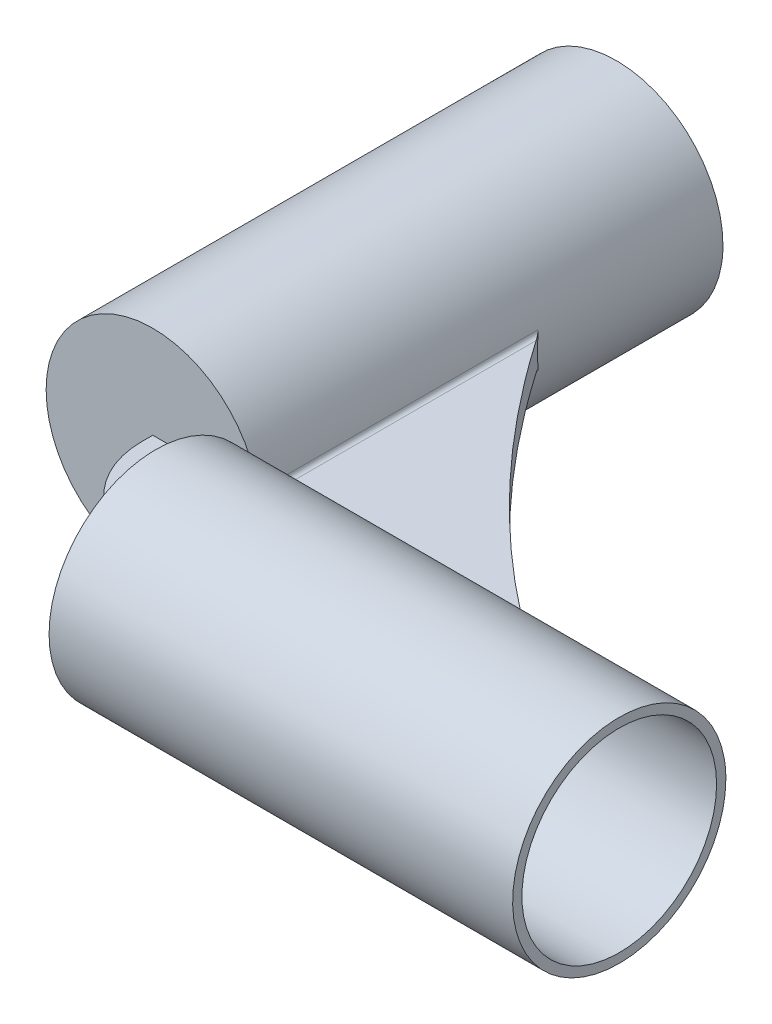
ISO-10303-21;
HEADER;
FILE_DESCRIPTION(('STEP AP214'),'2;1');
FILE_NAME('part.step','',(''),(''),'','','');
FILE_SCHEMA(('AUTOMOTIVE_DESIGN { 1 0 10303 214 1 1 1 1 }'));
ENDSEC;
DATA;
#1=APPLICATION_CONTEXT('core data for automotive mechanical design processes');
#2=APPLICATION_PROTOCOL_DEFINITION('international standard','automotive_design',2000,#1);
#3=PRODUCT_CONTEXT('',#1,'mechanical');
#4=PRODUCT('Part','Part','',(#3));
#5=PRODUCT_RELATED_PRODUCT_CATEGORY('part','',(#4));
#6=PRODUCT_DEFINITION_FORMATION('','',#4);
#7=PRODUCT_DEFINITION_CONTEXT('part definition',#1,'design');
#8=PRODUCT_DEFINITION('design','',#6,#7);
#9=PRODUCT_DEFINITION_SHAPE('','',#8);
#10=(LENGTH_UNIT() NAMED_UNIT(*) SI_UNIT(.MILLI.,.METRE.));
#11=(NAMED_UNIT(*) PLANE_ANGLE_UNIT() SI_UNIT($,.RADIAN.));
#12=(NAMED_UNIT(*) SI_UNIT($,.STERADIAN.) SOLID_ANGLE_UNIT());
#13=UNCERTAINTY_MEASURE_WITH_UNIT(LENGTH_MEASURE(1.E-05),#10,'distance_accuracy_value','');
#14=(GEOMETRIC_REPRESENTATION_CONTEXT(3) GLOBAL_UNCERTAINTY_ASSIGNED_CONTEXT((#13)) GLOBAL_UNIT_ASSIGNED_CONTEXT((#10,
#11,#12)) REPRESENTATION_CONTEXT('',''));
#15=CARTESIAN_POINT('',(0.,0.,0.));
#16=DIRECTION('',(0.,0.,1.));
#17=DIRECTION('',(1.,0.,0.));
#18=AXIS2_PLACEMENT_3D('',#15,#16,#17);
#19=CARTESIAN_POINT('',(26.1714704420663,-1.5,37.7135369474852));
#20=DIRECTION('',(0.,1.,0.));
#21=DIRECTION('',(0.,0.,1.));
#22=AXIS2_PLACEMENT_3D('',#19,#20,#21);
#23=PLANE('',#22);
#24=CARTESIAN_POINT('',(61.5,-1.5,61.1844233042564));
#25=CARTESIAN_POINT('',(21.5929408841325,-1.5,44.8348622428421));
#26=CARTESIAN_POINT('',(0.,-1.5,0.));
#27=B_SPLINE_CURVE_WITH_KNOTS('',2,(#24,#25,#26),.UNSPECIFIED.,.F.,.F.,(3,3),(0.,1.),.UNSPECIFIED.);
#28=CARTESIAN_POINT('',(39.9591197955266,-1.5,49.3522637381935));
#29=VERTEX_POINT('',#28);
#30=CARTESIAN_POINT('',(11.8321595617195,-1.5,20.4798726120123));
#31=VERTEX_POINT('',#30);
#32=EDGE_CURVE('E48',#29,#31,#27,.T.);
#33=ORIENTED_EDGE('',*,*,#32,.F.);
#34=DIRECTION('',(1.,0.,0.));
#35=VECTOR('',#34,1.);
#36=CARTESIAN_POINT('',(11.5,-1.5,49.3522637380573));
#37=LINE('',#36,#35);
#38=CARTESIAN_POINT('',(11.8321595661992,-1.5,49.3522637380573));
#39=VERTEX_POINT('',#38);
#40=EDGE_CURVE('E267',#29,#39,#37,.F.);
#41=ORIENTED_EDGE('',*,*,#40,.T.);
#42=DIRECTION('',(0.,0.,1.));
#43=VECTOR('',#42,1.);
#44=CARTESIAN_POINT('',(11.8321595661992,-1.5,19.8540203703433));
#45=LINE('',#44,#43);
#46=EDGE_CURVE('E99',#39,#31,#45,.F.);
#47=ORIENTED_EDGE('',*,*,#46,.T.);
#48=EDGE_LOOP('',(#33,#41,#47));
#49=FACE_BOUND('',#48,.T.);
#50=ADVANCED_FACE('F44',(#49),#23,.F.);
#51=CARTESIAN_POINT('',(26.1714704420663,1.5,37.7135369474852));
#52=DIRECTION('',(0.,1.,0.));
#53=DIRECTION('',(0.,0.,1.));
#54=AXIS2_PLACEMENT_3D('',#51,#52,#53);
#55=PLANE('',#54);
#56=DIRECTION('',(0.,0.,-1.));
#57=VECTOR('',#56,1.);
#58=CARTESIAN_POINT('',(11.4999999999999,1.5,37.7135369474852));
#59=LINE('',#58,#57);
#60=CARTESIAN_POINT('',(11.5,1.5,61.1419503280094));
#61=VERTEX_POINT('',#60);
#62=CARTESIAN_POINT('',(11.5,1.5,50.));
#63=VERTEX_POINT('',#62);
#64=EDGE_CURVE('E266',#61,#63,#59,.T.);
#65=ORIENTED_EDGE('',*,*,#64,.T.);
#66=DIRECTION('',(-1.,0.,0.));
#67=VECTOR('',#66,1.);
#68=CARTESIAN_POINT('',(0.,1.5,50.));
#69=LINE('',#68,#67);
#70=CARTESIAN_POINT('',(0.,1.5,50.));
#71=VERTEX_POINT('',#70);
#72=EDGE_CURVE('E90',#63,#71,#69,.T.);
#73=ORIENTED_EDGE('',*,*,#72,.T.);
#74=DIRECTION('',(0.,0.,1.));
#75=VECTOR('',#74,1.);
#76=CARTESIAN_POINT('',(0.,1.5,61.1321815434726));
#77=LINE('',#76,#75);
#78=CARTESIAN_POINT('',(0.,1.5,51.1406725308152));
#79=VERTEX_POINT('',#78);
#80=EDGE_CURVE('E158',#71,#79,#77,.T.);
#81=ORIENTED_EDGE('',*,*,#80,.T.);
#82=CARTESIAN_POINT('',(10.,1.5,51.1406725308152));
#83=DIRECTION('',(0.,1.,0.));
#84=DIRECTION('',(0.,0.,1.));
#85=AXIS2_PLACEMENT_3D('',#82,#83,#84);
#86=CIRCLE('',#85,10.);
#87=CARTESIAN_POINT('',(9.99150540781538,1.5,61.1406689229097));
#88=VERTEX_POINT('',#87);
#89=EDGE_CURVE('E165',#79,#88,#86,.T.);
#90=ORIENTED_EDGE('',*,*,#89,.T.);
#91=DIRECTION('',(0.999999639209453,0.,0.000849459218462283));
#92=VECTOR('',#91,1.);
#93=CARTESIAN_POINT('',(61.5,1.5,61.1844233042564));
#94=LINE('',#93,#92);
#95=EDGE_CURVE('E170',#88,#61,#94,.T.);
#96=ORIENTED_EDGE('',*,*,#95,.T.);
#97=EDGE_LOOP('',(#65,#73,#81,#90,#96));
#98=FACE_BOUND('',#97,.T.);
#99=ADVANCED_FACE('F164',(#98),#55,.T.);
#100=CARTESIAN_POINT('',(61.5,1.5,61.1844233042564));
#101=CARTESIAN_POINT('',(21.5929408841325,1.5,44.8348622428421));
#102=CARTESIAN_POINT('',(0.,1.5,0.));
#103=B_SPLINE_CURVE_WITH_KNOTS('',2,(#100,#101,#102),.UNSPECIFIED.,.F.,.F.,(3,3),(0.,1.),.UNSPECIFIED.);
#104=DIRECTION('',(0.,-1.,0.));
#105=VECTOR('',#104,1.);
#106=SURFACE_OF_LINEAR_EXTRUSION('',#103,#105);
#107=CARTESIAN_POINT('',(40.6592068639217,-1.91666666666667,49.8452703866488));
#108=CARTESIAN_POINT('',(40.6425501103773,-1.84786208140813,49.8336404502735));
#109=CARTESIAN_POINT('',(40.6267530440321,-1.77875662178033,49.8226037211432));
#110=CARTESIAN_POINT('',(40.5968843253305,-1.63985466646673,49.8017249348678));
#111=CARTESIAN_POINT('',(40.5828160010725,-1.57005710901577,49.7918851824445));
#112=CARTESIAN_POINT('',(40.5351088290527,-1.31629838707604,49.7585028006326));
#113=CARTESIAN_POINT('',(40.5067431395523,-1.13081215657099,49.7386244397177));
#114=CARTESIAN_POINT('',(40.462879679633,-0.757487481015358,49.7078679157044));
#115=CARTESIAN_POINT('',(40.4473897663862,-0.569647670596903,49.6969952481556));
#116=CARTESIAN_POINT('',(40.4295910935103,-0.193058017227148,49.6845009250577));
#117=CARTESIAN_POINT('',(40.4272804681157,-0.00430830687532004,49.6828779600466));
#118=CARTESIAN_POINT('',(40.4358835274511,0.372644328864946,49.6889182158702));
#119=CARTESIAN_POINT('',(40.4467895631452,0.560847507389801,49.6965760655084));
#120=CARTESIAN_POINT('',(40.4759404704321,0.874581473730704,49.7170263921436));
#121=CARTESIAN_POINT('',(40.4906529560247,1.00062118829927,49.7273445390168));
#122=CARTESIAN_POINT('',(40.5258597853129,1.25137278723459,49.7520170781482));
#123=CARTESIAN_POINT('',(40.5463482652861,1.37608588580541,49.7663673769639));
#124=CARTESIAN_POINT('',(40.5828013075669,1.56997673331845,49.791874929953));
#125=CARTESIAN_POINT('',(40.5968531106718,1.63969866391494,49.801703117051));
#126=CARTESIAN_POINT('',(40.6267180390527,1.77860463977761,49.8225792502017));
#127=CARTESIAN_POINT('',(40.6425317313701,1.84778850416581,49.8336275889343));
#128=CARTESIAN_POINT('',(40.6592068639217,1.91666666666667,49.8452703866488));
#129=B_SPLINE_CURVE_WITH_KNOTS('',3,(#107,#108,#109,#110,#111,#112,#113,#114,#115,#116,#117,
#118,#119,#120,#121,#122,#123,#124,#125,#126,#127,#128),.UNSPECIFIED.,.F.,.F.,(4,2,2,2,2,2,2,2,
2,2,4),(0.,0.215199849304263,0.430807708595344,0.996168056278801,1.56187315049264,
2.12749815697276,2.69279596881663,3.07455562803561,3.45592911632852,3.67129821337173,
3.88673682548817),.UNSPECIFIED.);
#130=CARTESIAN_POINT('',(40.6592068639218,-1.91666666666666,49.8452703866488));
#131=VERTEX_POINT('',#130);
#132=CARTESIAN_POINT('',(40.6592068639217,1.91666666666666,49.8452703866488));
#133=VERTEX_POINT('',#132);
#134=EDGE_CURVE('E162',#131,#133,#129,.T.);
#135=ORIENTED_EDGE('',*,*,#134,.F.);
#136=CARTESIAN_POINT('',(40.6592068639218,-1.91666666666666,49.8452703866488));
#137=CARTESIAN_POINT('',(40.6534948312875,-1.89303407075664,49.8412821935652));
#138=CARTESIAN_POINT('',(40.6455246430659,-1.87045745755028,49.8357165409185));
#139=CARTESIAN_POINT('',(40.6262566238628,-1.82797444168572,49.8222556999883));
#140=CARTESIAN_POINT('',(40.6150156241668,-1.80803025836246,49.8144002930168));
#141=CARTESIAN_POINT('',(40.5864783140091,-1.76506980361908,49.7944476597912));
#142=CARTESIAN_POINT('',(40.5683735501093,-1.74287704119174,49.781782451699));
#143=CARTESIAN_POINT('',(40.5294833582413,-1.70206370401495,49.7545558428827));
#144=CARTESIAN_POINT('',(40.5086784618006,-1.68347178934001,49.7399806626619));
#145=CARTESIAN_POINT('',(40.4516053296794,-1.63875510978594,49.6999636819857));
#146=CARTESIAN_POINT('',(40.4139222559375,-1.61536617584461,49.6735093461784));
#147=CARTESIAN_POINT('',(40.3362107443147,-1.57566747539168,49.6188730753598));
#148=CARTESIAN_POINT('',(40.2961781753437,-1.55937062939773,49.5906880930911));
#149=CARTESIAN_POINT('',(40.2312347512579,-1.53821309576535,49.5448951380918));
#150=CARTESIAN_POINT('',(40.2067216619404,-1.53138942034216,49.52759516247));
#151=CARTESIAN_POINT('',(40.1573801002096,-1.51978767468377,49.4927409507969));
#152=CARTESIAN_POINT('',(40.1325515296538,-1.51501025789447,49.4751866353728));
#153=CARTESIAN_POINT('',(40.0829823353489,-1.50745343697358,49.4401080184524));
#154=CARTESIAN_POINT('',(40.058243652195,-1.50465303515744,49.4225854359925));
#155=CARTESIAN_POINT('',(40.0087067986515,-1.50093023434502,49.3874662984272));
#156=CARTESIAN_POINT('',(39.9839086913586,-1.50000634090523,49.3698698133787));
#157=CARTESIAN_POINT('',(39.9591197954626,-1.5,49.352263738148));
#158=B_SPLINE_CURVE_WITH_KNOTS('',3,(#136,#137,#138,#139,#140,#141,#142,#143,#144,#145,#146,
#147,#148,#149,#150,#151,#152,#153,#154,#155,#156,#157),.UNSPECIFIED.,.F.,.F.,(4,2,2,2,2,2,2,2,
2,2,4),(0.,0.0734012187649057,0.145596320474933,0.239040182630463,0.333199703987055,
0.487281872786016,0.641643588458705,0.733886183631671,0.826158213347521,0.917434855049991,
1.00863877586489),.UNSPECIFIED.);
#159=EDGE_CURVE('E172',#131,#29,#158,.T.);
#160=ORIENTED_EDGE('',*,*,#159,.T.);
#161=ORIENTED_EDGE('',*,*,#32,.T.);
#162=CARTESIAN_POINT('',(11.8321595661992,-1.5,20.4798726120123));
#163=CARTESIAN_POINT('',(11.8081094150477,-1.50002370111057,20.4451111264115));
#164=CARTESIAN_POINT('',(11.7840675332719,-1.50173712524963,20.410325939331));
#165=CARTESIAN_POINT('',(11.7360926871098,-1.50870829394207,20.3408440912597));
#166=CARTESIAN_POINT('',(11.7121604774124,-1.51397940499566,20.3061482612705));
#167=CARTESIAN_POINT('',(11.6645905057809,-1.5282604175751,20.2371152039247));
#168=CARTESIAN_POINT('',(11.640954231312,-1.53728462840712,20.202779870299));
#169=CARTESIAN_POINT('',(11.5943649938752,-1.5594108375592,20.1350362985247));
#170=CARTESIAN_POINT('',(11.5714108589505,-1.57250533881332,20.101626477901));
#171=CARTESIAN_POINT('',(11.5317039918901,-1.59979348137028,20.0437795689982));
#172=CARTESIAN_POINT('',(11.5147386177175,-1.61304259131244,20.0190452612058));
#173=CARTESIAN_POINT('',(11.4816699903266,-1.64271582471135,19.9708008342689));
#174=CARTESIAN_POINT('',(11.4655687551884,-1.65914699970938,19.9472935839804));
#175=CARTESIAN_POINT('',(11.4345199985781,-1.69590953363564,19.9019350686278));
#176=CARTESIAN_POINT('',(11.4195914508104,-1.71629155604546,19.8801111128867));
#177=CARTESIAN_POINT('',(11.3920507374661,-1.76126982871442,19.8398273898705));
#178=CARTESIAN_POINT('',(11.3794200332247,-1.7858289445653,19.8213407082531));
#179=CARTESIAN_POINT('',(11.3622162605981,-1.8284211040254,19.7961506869004));
#180=CARTESIAN_POINT('',(11.3564714926554,-1.84495058325497,19.7877365733781));
#181=CARTESIAN_POINT('',(11.3465186872924,-1.87964652988499,19.7731565155303));
#182=CARTESIAN_POINT('',(11.3423304548717,-1.89783065648012,19.7670195465314));
#183=CARTESIAN_POINT('',(11.3391529176076,-1.91666666666684,19.7623631352614));
#184=B_SPLINE_CURVE_WITH_KNOTS('',3,(#162,#163,#164,#165,#166,#167,#168,#169,#170,#171,#172,
#173,#174,#175,#176,#177,#178,#179,#180,#181,#182,#183),.UNSPECIFIED.,.F.,.F.,(4,2,2,2,2,2,2,2,
2,2,4),(0.,0.126800562084867,0.254080195145305,0.381849617109322,0.509385081363142,
0.607604761143041,0.706044641831131,0.805842138836599,0.904794839726361,0.962809628095832,
1.02153917679552),.UNSPECIFIED.);
#185=CARTESIAN_POINT('',(11.3391529176076,-1.91666666666667,19.7623631352611));
#186=VERTEX_POINT('',#185);
#187=EDGE_CURVE('E203',#31,#186,#184,.T.);
#188=ORIENTED_EDGE('',*,*,#187,.T.);
#189=CARTESIAN_POINT('',(11.3391529176074,-1.91666666666807,19.7623631352611));
#190=CARTESIAN_POINT('',(11.3507799975667,-1.84787908265887,19.7794017329531));
#191=CARTESIAN_POINT('',(11.3618155766701,-1.77878222811811,19.7955652730237));
#192=CARTESIAN_POINT('',(11.382694712914,-1.6398800422499,19.8261337415504));
#193=CARTESIAN_POINT('',(11.3925359443036,-1.57007360666333,19.8405352392158));
#194=CARTESIAN_POINT('',(11.425541697391,-1.3191780530857,19.8888181748417));
#195=CARTESIAN_POINT('',(11.445181237914,-1.13657707818301,19.9175141148101));
#196=CARTESIAN_POINT('',(11.4757427912019,-0.769004637503896,19.962148028165));
#197=CARTESIAN_POINT('',(11.4866595720239,-0.584031816558466,19.9780783447008));
#198=CARTESIAN_POINT('',(11.4995218435123,-0.213128100523489,19.9968460463756));
#199=CARTESIAN_POINT('',(11.5014684502105,-0.0271973275001735,19.9996850602802));
#200=CARTESIAN_POINT('',(11.4963471172089,0.34418178882737,19.9922136537984));
#201=CARTESIAN_POINT('',(11.489284251006,0.529630344772638,19.9819106340744));
#202=CARTESIAN_POINT('',(11.4695749301962,0.846420247756011,19.9531396879581));
#203=CARTESIAN_POINT('',(11.4590790541375,0.978196215681208,19.9378145497305));
#204=CARTESIAN_POINT('',(11.4336788188877,1.2402800642973,19.9007039856013));
#205=CARTESIAN_POINT('',(11.4187789864561,1.37058931052918,19.8789251932535));
#206=CARTESIAN_POINT('',(11.3925460115424,1.56999489762221,19.8405499952391));
#207=CARTESIAN_POINT('',(11.3827161426456,1.63972692708785,19.8261651159792));
#208=CARTESIAN_POINT('',(11.3618396119236,1.77863284445968,19.7956004623972));
#209=CARTESIAN_POINT('',(11.3507926317531,1.84780658123796,19.779420218475));
#210=CARTESIAN_POINT('',(11.3391529176091,1.91666666665772,19.7623631352636));
#211=B_SPLINE_CURVE_WITH_KNOTS('',3,(#189,#190,#191,#192,#193,#194,#195,#196,#197,#198,#199,
#200,#201,#202,#203,#204,#205,#206,#207,#208,#209,#210),.UNSPECIFIED.,.F.,.F.,(4,2,2,2,2,2,2,2,
2,2,4),(0.,0.215418321122951,0.431249614907638,0.988193043475371,1.54547027849335,
2.10267817751875,2.65957243501206,3.05858875104212,3.45719634222962,3.67279288723449,
3.8884459577394),.UNSPECIFIED.);
#212=CARTESIAN_POINT('',(11.3391529176076,1.91666666666667,19.7623631352636));
#213=VERTEX_POINT('',#212);
#214=EDGE_CURVE('E195',#186,#213,#211,.T.);
#215=ORIENTED_EDGE('',*,*,#214,.T.);
#216=CARTESIAN_POINT('',(11.3391529176076,1.91666666666667,19.7623631352636));
#217=CARTESIAN_POINT('',(11.3431329309809,1.89309286038007,19.7681955687414));
#218=CARTESIAN_POINT('',(11.3486737913801,1.8706010371776,19.7763143578962));
#219=CARTESIAN_POINT('',(11.3620447926618,1.82832384701994,19.7958996057239));
#220=CARTESIAN_POINT('',(11.3698349965959,1.80849942813869,19.8073076590742));
#221=CARTESIAN_POINT('',(11.3896587706362,1.76566995199544,19.8363259472208));
#222=CARTESIAN_POINT('',(11.4022630871797,1.74351717515564,19.8547684047036));
#223=CARTESIAN_POINT('',(11.4293274456438,1.70280142552842,19.8943443268736));
#224=CARTESIAN_POINT('',(11.4438013501768,1.68426816862998,19.915497883615));
#225=CARTESIAN_POINT('',(11.4838288397983,1.63933219577045,19.9739588333785));
#226=CARTESIAN_POINT('',(11.5104051966382,1.61577763727474,20.0127352873308));
#227=CARTESIAN_POINT('',(11.5652440679982,1.5758488257949,20.0926524670509));
#228=CARTESIAN_POINT('',(11.5935094566671,1.55948723219623,20.1337972182042));
#229=CARTESIAN_POINT('',(11.6393997411275,1.53826517394161,20.2005159126294));
#230=CARTESIAN_POINT('',(11.6567269251058,1.53142637027715,20.225689456875));
#231=CARTESIAN_POINT('',(11.6916252922121,1.51980342103164,20.2763537660823));
#232=CARTESIAN_POINT('',(11.7091965514979,1.51501993233536,20.3018446297857));
#233=CARTESIAN_POINT('',(11.7442992111563,1.50745587952995,20.3527307414204));
#234=CARTESIAN_POINT('',(11.7618289668801,1.50465409912515,20.3781240144288));
#235=CARTESIAN_POINT('',(11.7969564899013,1.50093016971331,20.4289717111169));
#236=CARTESIAN_POINT('',(11.8145541917286,1.50000652188371,20.454426069792));
#237=CARTESIAN_POINT('',(11.8321595631639,1.5,20.4798726141));
#238=B_SPLINE_CURVE_WITH_KNOTS('',3,(#216,#217,#218,#219,#220,#221,#222,#223,#224,#225,#226,
#227,#228,#229,#230,#231,#232,#233,#234,#235,#236,#237),.UNSPECIFIED.,.F.,.F.,(4,2,2,2,2,2,2,2,
2,2,4),(0.,0.073298342853817,0.145367844380267,0.23924135710184,0.333855848244422,
0.490738290445111,0.6478957459797,0.74177993738456,0.835694112177454,0.928586959781961,
1.02140564615397),.UNSPECIFIED.);
#239=CARTESIAN_POINT('',(11.8321595617195,1.5,20.4798726120123));
#240=VERTEX_POINT('',#239);
#241=EDGE_CURVE('E202',#213,#240,#238,.T.);
#242=ORIENTED_EDGE('',*,*,#241,.T.);
#243=CARTESIAN_POINT('',(39.9591197955266,1.5,49.3522637381935));
#244=VERTEX_POINT('',#243);
#245=EDGE_CURVE('E222',#244,#240,#103,.T.);
#246=ORIENTED_EDGE('',*,*,#245,.F.);
#247=CARTESIAN_POINT('',(39.9591197955266,1.5,49.3522637380572));
#248=CARTESIAN_POINT('',(39.9924102161727,1.50002141006099,49.3759081329797));
#249=CARTESIAN_POINT('',(40.0257251718583,1.50167883780718,49.3995405578493));
#250=CARTESIAN_POINT('',(40.0922665207776,1.5084113051976,49.4466856301115));
#251=CARTESIAN_POINT('',(40.1254922011132,1.51349823127148,49.4701975733773));
#252=CARTESIAN_POINT('',(40.1915970419865,1.52726101383605,49.5169200159809));
#253=CARTESIAN_POINT('',(40.2244745880398,1.53594933642551,49.540129176549));
#254=CARTESIAN_POINT('',(40.2893639651839,1.5572148951821,49.585882451517));
#255=CARTESIAN_POINT('',(40.3213771735856,1.56978549190818,49.6084276298963));
#256=CARTESIAN_POINT('',(40.37774871859,1.59634158065631,49.6480823171788));
#257=CARTESIAN_POINT('',(40.4023512866643,1.60953353479868,49.6653728298712));
#258=CARTESIAN_POINT('',(40.4503348652031,1.63912333509124,49.6990663859896));
#259=CARTESIAN_POINT('',(40.4737131814022,1.6555279041618,49.7154674746256));
#260=CARTESIAN_POINT('',(40.5188200335586,1.69224897463631,49.7470871375683));
#261=CARTESIAN_POINT('',(40.5405220811709,1.71261522987005,49.762286790461));
#262=CARTESIAN_POINT('',(40.5806094692239,1.75755314833701,49.7903435828851));
#263=CARTESIAN_POINT('',(40.5990206088086,1.78208886365166,49.8032189524038));
#264=CARTESIAN_POINT('',(40.6245057738606,1.82517525172052,49.8210322742419));
#265=CARTESIAN_POINT('',(40.6331911303596,1.84228610082833,49.8271006447168));
#266=CARTESIAN_POINT('',(40.6481954748952,1.8782447518918,49.8375815668041));
#267=CARTESIAN_POINT('',(40.6544831528787,1.89711178093819,49.8419722112793));
#268=CARTESIAN_POINT('',(40.6592068639217,1.91666666666667,49.8452703866488));
#269=B_SPLINE_CURVE_WITH_KNOTS('',3,(#247,#248,#249,#250,#251,#252,#253,#254,#255,#256,#257,
#258,#259,#260,#261,#262,#263,#264,#265,#266,#267,#268),.UNSPECIFIED.,.F.,.F.,(4,2,2,2,2,2,2,2,
2,2,4),(0.,0.122486287368088,0.245399302148346,0.36874137642808,0.491873669124276,
0.590232028161441,0.688798461006967,0.788693622284827,0.887767571640208,0.947887373396413,
1.00876735679771),.UNSPECIFIED.);
#270=EDGE_CURVE('E228',#244,#133,#269,.T.);
#271=ORIENTED_EDGE('',*,*,#270,.T.);
#272=EDGE_LOOP('',(#135,#160,#161,#188,#215,#242,#246,#271));
#273=FACE_BOUND('',#272,.T.);
#274=ADVANCED_FACE('F210',(#273),#106,.F.);
#275=ORIENTED_EDGE('',*,*,#245,.T.);
#276=DIRECTION('',(0.,0.,-1.));
#277=VECTOR('',#276,1.);
#278=CARTESIAN_POINT('',(11.8321595661992,1.5,37.7135369474852));
#279=LINE('',#278,#277);
#280=CARTESIAN_POINT('',(11.8321595661992,1.5,49.3522637380573));
#281=VERTEX_POINT('',#280);
#282=EDGE_CURVE('E227',#240,#281,#279,.F.);
#283=ORIENTED_EDGE('',*,*,#282,.T.);
#284=DIRECTION('',(-1.,0.,0.));
#285=VECTOR('',#284,1.);
#286=CARTESIAN_POINT('',(26.1714704420663,1.5,49.3522637380573));
#287=LINE('',#286,#285);
#288=EDGE_CURVE('E179',#281,#244,#287,.F.);
#289=ORIENTED_EDGE('',*,*,#288,.T.);
#290=EDGE_LOOP('',(#275,#283,#289));
#291=FACE_BOUND('',#290,.T.);
#292=ADVANCED_FACE('F216',(#291),#55,.T.);
#293=DIRECTION('',(-1.,0.,0.));
#294=VECTOR('',#293,1.);
#295=CARTESIAN_POINT('',(0.,-1.5,50.));
#296=LINE('',#295,#294);
#297=CARTESIAN_POINT('',(11.5,-1.5,50.));
#298=VERTEX_POINT('',#297);
#299=CARTESIAN_POINT('',(0.,-1.5,50.));
#300=VERTEX_POINT('',#299);
#301=EDGE_CURVE('E307',#298,#300,#296,.T.);
#302=ORIENTED_EDGE('',*,*,#301,.F.);
#303=DIRECTION('',(0.,0.,-1.));
#304=VECTOR('',#303,1.);
#305=CARTESIAN_POINT('',(11.4999999999999,-1.5,37.7135369474852));
#306=LINE('',#305,#304);
#307=CARTESIAN_POINT('',(11.5,-1.5,61.1419503280094));
#308=VERTEX_POINT('',#307);
#309=EDGE_CURVE('E185',#308,#298,#306,.T.);
#310=ORIENTED_EDGE('',*,*,#309,.F.);
#311=DIRECTION('',(0.999999639209453,0.,0.000849459218462283));
#312=VECTOR('',#311,1.);
#313=CARTESIAN_POINT('',(61.5,-1.5,61.1844233042564));
#314=LINE('',#313,#312);
#315=CARTESIAN_POINT('',(9.99150540781538,-1.5,61.1406689229097));
#316=VERTEX_POINT('',#315);
#317=EDGE_CURVE('E181',#316,#308,#314,.T.);
#318=ORIENTED_EDGE('',*,*,#317,.F.);
#319=CARTESIAN_POINT('',(10.,-1.5,51.1406725308152));
#320=DIRECTION('',(0.,1.,0.));
#321=DIRECTION('',(0.,0.,1.));
#322=AXIS2_PLACEMENT_3D('',#319,#320,#321);
#323=CIRCLE('',#322,10.);
#324=CARTESIAN_POINT('',(0.,-1.5,51.1406725308152));
#325=VERTEX_POINT('',#324);
#326=EDGE_CURVE('E65',#316,#325,#323,.F.);
#327=ORIENTED_EDGE('',*,*,#326,.T.);
#328=DIRECTION('',(0.,0.,1.));
#329=VECTOR('',#328,1.);
#330=CARTESIAN_POINT('',(0.,-1.5,61.1321815434726));
#331=LINE('',#330,#329);
#332=EDGE_CURVE('E160',#300,#325,#331,.T.);
#333=ORIENTED_EDGE('',*,*,#332,.F.);
#334=EDGE_LOOP('',(#302,#310,#318,#327,#333));
#335=FACE_BOUND('',#334,.T.);
#336=ADVANCED_FACE('F294',(#335),#23,.F.);
#337=CARTESIAN_POINT('',(61.5,1.5,61.1844233042564));
#338=DIRECTION('',(0.000849459218462283,0.,-0.999999639209453));
#339=DIRECTION('',(-0.999999639209453,0.,-0.000849459218462283));
#340=AXIS2_PLACEMENT_3D('',#337,#338,#339);
#341=PLANE('',#340);
#342=ORIENTED_EDGE('',*,*,#95,.F.);
#343=DIRECTION('',(0.,-1.,0.));
#344=VECTOR('',#343,1.);
#345=CARTESIAN_POINT('',(9.99150540781538,1.5,61.1406689229097));
#346=LINE('',#345,#344);
#347=EDGE_CURVE('E169',#88,#316,#346,.T.);
#348=ORIENTED_EDGE('',*,*,#347,.T.);
#349=ORIENTED_EDGE('',*,*,#317,.T.);
#350=DIRECTION('',(0.,-1.,0.));
#351=VECTOR('',#350,1.);
#352=CARTESIAN_POINT('',(11.5,1.5,61.1419503280094));
#353=LINE('',#352,#351);
#354=EDGE_CURVE('E182',#61,#308,#353,.T.);
#355=ORIENTED_EDGE('',*,*,#354,.F.);
#356=EDGE_LOOP('',(#342,#348,#349,#355));
#357=FACE_BOUND('',#356,.T.);
#358=ADVANCED_FACE('F46',(#357),#341,.F.);
#359=CARTESIAN_POINT('',(0.,0.,50.));
#360=DIRECTION('',(0.,0.,-1.));
#361=DIRECTION('',(-1.,0.,0.));
#362=AXIS2_PLACEMENT_3D('',#359,#360,#361);
#363=CYLINDRICAL_SURFACE('',#362,11.5);
#364=CARTESIAN_POINT('',(0.,0.,50.));
#365=DIRECTION('',(0.,0.,1.));
#366=DIRECTION('',(1.,0.,0.));
#367=AXIS2_PLACEMENT_3D('',#364,#365,#366);
#368=CIRCLE('',#367,11.5);
#369=CARTESIAN_POINT('',(11.3391529176076,1.91666666666667,50.));
#370=VERTEX_POINT('',#369);
#371=CARTESIAN_POINT('',(11.3391529176076,-1.91666666666667,50.));
#372=VERTEX_POINT('',#371);
#373=EDGE_CURVE('E191',#370,#372,#368,.T.);
#374=ORIENTED_EDGE('',*,*,#373,.F.);
#375=DIRECTION('',(0.,0.,-1.));
#376=VECTOR('',#375,1.);
#377=CARTESIAN_POINT('',(11.3391529176076,1.91666666666667,50.));
#378=LINE('',#377,#376);
#379=EDGE_CURVE('E234',#370,#213,#378,.T.);
#380=ORIENTED_EDGE('',*,*,#379,.T.);
#381=ORIENTED_EDGE('',*,*,#214,.F.);
#382=DIRECTION('',(0.,0.,-1.));
#383=VECTOR('',#382,1.);
#384=CARTESIAN_POINT('',(11.3391529176076,-1.91666666666667,50.));
#385=LINE('',#384,#383);
#386=EDGE_CURVE('E175',#186,#372,#385,.F.);
#387=ORIENTED_EDGE('',*,*,#386,.T.);
#388=EDGE_LOOP('',(#374,#380,#381,#387));
#389=FACE_BOUND('',#388,.T.);
#390=CARTESIAN_POINT('',(0.,0.,0.));
#391=DIRECTION('',(0.,0.,1.));
#392=DIRECTION('',(1.,0.,0.));
#393=AXIS2_PLACEMENT_3D('',#390,#391,#392);
#394=CIRCLE('',#393,11.5);
#395=CARTESIAN_POINT('',(11.5,0.,0.));
#396=VERTEX_POINT('',#395);
#397=EDGE_CURVE('E187',#396,#396,#394,.T.);
#398=ORIENTED_EDGE('',*,*,#397,.T.);
#399=EDGE_LOOP('',(#398));
#400=FACE_BOUND('',#399,.T.);
#401=ADVANCED_FACE('F206',(#389,#400),#363,.T.);
#402=CARTESIAN_POINT('',(0.,0.,50.));
#403=DIRECTION('',(0.,0.,1.));
#404=DIRECTION('',(1.,0.,0.));
#405=AXIS2_PLACEMENT_3D('',#402,#403,#404);
#406=PLANE('',#405);
#407=ORIENTED_EDGE('',*,*,#72,.F.);
#408=DIRECTION('',(0.,-1.,0.));
#409=VECTOR('',#408,1.);
#410=CARTESIAN_POINT('',(11.5,0.,50.));
#411=LINE('',#410,#409);
#412=CARTESIAN_POINT('',(11.5,1.62627547232981,50.));
#413=VERTEX_POINT('',#412);
#414=EDGE_CURVE('E186',#413,#63,#411,.T.);
#415=ORIENTED_EDGE('',*,*,#414,.F.);
#416=CARTESIAN_POINT('',(11.8321595661992,2.,50.));
#417=DIRECTION('',(0.,0.,1.));
#418=DIRECTION('',(1.,0.,0.));
#419=AXIS2_PLACEMENT_3D('',#416,#417,#418);
#420=CIRCLE('',#419,0.5);
#421=EDGE_CURVE('E190',#413,#370,#420,.F.);
#422=ORIENTED_EDGE('',*,*,#421,.T.);
#423=ORIENTED_EDGE('',*,*,#373,.T.);
#424=CARTESIAN_POINT('',(11.8321595661992,-2.,50.));
#425=DIRECTION('',(0.,0.,1.));
#426=DIRECTION('',(1.,0.,0.));
#427=AXIS2_PLACEMENT_3D('',#424,#425,#426);
#428=CIRCLE('',#427,0.5);
#429=CARTESIAN_POINT('',(11.5,-1.62627547232981,50.));
#430=VERTEX_POINT('',#429);
#431=EDGE_CURVE('E194',#372,#430,#428,.F.);
#432=ORIENTED_EDGE('',*,*,#431,.T.);
#433=DIRECTION('',(0.,-1.,0.));
#434=VECTOR('',#433,1.);
#435=CARTESIAN_POINT('',(11.5,0.,50.));
#436=LINE('',#435,#434);
#437=EDGE_CURVE('E246',#298,#430,#436,.T.);
#438=ORIENTED_EDGE('',*,*,#437,.F.);
#439=ORIENTED_EDGE('',*,*,#301,.T.);
#440=DIRECTION('',(0.,1.,0.));
#441=VECTOR('',#440,1.);
#442=CARTESIAN_POINT('',(0.,0.,50.));
#443=LINE('',#442,#441);
#444=EDGE_CURVE('E204',#300,#71,#443,.T.);
#445=ORIENTED_EDGE('',*,*,#444,.T.);
#446=EDGE_LOOP('',(#407,#415,#422,#423,#432,#438,#439,#445));
#447=FACE_BOUND('',#446,.T.);
#448=ADVANCED_FACE('F313',(#447),#406,.T.);
#449=CARTESIAN_POINT('',(0.,0.,0.));
#450=DIRECTION('',(0.,0.,1.));
#451=DIRECTION('',(1.,0.,0.));
#452=AXIS2_PLACEMENT_3D('',#449,#450,#451);
#453=PLANE('',#452);
#454=CARTESIAN_POINT('',(0.,0.,0.));
#455=DIRECTION('',(0.,0.,-1.));
#456=DIRECTION('',(-1.,0.,0.));
#457=AXIS2_PLACEMENT_3D('',#454,#455,#456);
#458=CIRCLE('',#457,10.5);
#459=CARTESIAN_POINT('',(-10.5,0.,0.));
#460=VERTEX_POINT('',#459);
#461=EDGE_CURVE('E332',#460,#460,#458,.T.);
#462=ORIENTED_EDGE('',*,*,#461,.F.);
#463=EDGE_LOOP('',(#462));
#464=FACE_BOUND('',#463,.T.);
#465=ORIENTED_EDGE('',*,*,#397,.F.);
#466=EDGE_LOOP('',(#465));
#467=FACE_BOUND('',#466,.T.);
#468=ADVANCED_FACE('F422',(#464,#467),#453,.F.);
#469=CARTESIAN_POINT('',(0.,1.5,61.1321815434726));
#470=DIRECTION('',(1.,0.,0.));
#471=DIRECTION('',(0.,0.,-1.));
#472=AXIS2_PLACEMENT_3D('',#469,#470,#471);
#473=PLANE('',#472);
#474=ORIENTED_EDGE('',*,*,#332,.T.);
#475=DIRECTION('',(0.,-1.,0.));
#476=VECTOR('',#475,1.);
#477=CARTESIAN_POINT('',(0.,1.5,51.1406725308152));
#478=LINE('',#477,#476);
#479=EDGE_CURVE('E155',#325,#79,#478,.F.);
#480=ORIENTED_EDGE('',*,*,#479,.T.);
#481=ORIENTED_EDGE('',*,*,#80,.F.);
#482=ORIENTED_EDGE('',*,*,#444,.F.);
#483=EDGE_LOOP('',(#474,#480,#481,#482));
#484=FACE_BOUND('',#483,.T.);
#485=ADVANCED_FACE('F156',(#484),#473,.F.);
#486=CARTESIAN_POINT('',(61.5,0.,61.1844233042564));
#487=DIRECTION('',(-1.,0.,0.));
#488=DIRECTION('',(0.,0.,1.));
#489=AXIS2_PLACEMENT_3D('',#486,#487,#488);
#490=CYLINDRICAL_SURFACE('',#489,11.5);
#491=ORIENTED_EDGE('',*,*,#134,.T.);
#492=DIRECTION('',(-1.,0.,0.));
#493=VECTOR('',#492,1.);
#494=CARTESIAN_POINT('',(61.5,1.91666666666666,49.8452703866488));
#495=LINE('',#494,#493);
#496=CARTESIAN_POINT('',(11.5,1.91666666666667,49.8452703866489));
#497=VERTEX_POINT('',#496);
#498=EDGE_CURVE('E263',#133,#497,#495,.T.);
#499=ORIENTED_EDGE('',*,*,#498,.T.);
#500=CARTESIAN_POINT('',(11.5,0.,61.1844233042565));
#501=DIRECTION('',(1.,0.,0.));
#502=DIRECTION('',(0.,0.,-1.));
#503=AXIS2_PLACEMENT_3D('',#500,#501,#502);
#504=CIRCLE('',#503,11.5);
#505=CARTESIAN_POINT('',(11.5,-1.91666666666666,49.8452703866489));
#506=VERTEX_POINT('',#505);
#507=EDGE_CURVE('E262',#497,#506,#504,.T.);
#508=ORIENTED_EDGE('',*,*,#507,.T.);
#509=DIRECTION('',(-1.,0.,0.));
#510=VECTOR('',#509,1.);
#511=CARTESIAN_POINT('',(61.5,-1.91666666666666,49.8452703866488));
#512=LINE('',#511,#510);
#513=EDGE_CURVE('E258',#506,#131,#512,.F.);
#514=ORIENTED_EDGE('',*,*,#513,.T.);
#515=EDGE_LOOP('',(#491,#499,#508,#514));
#516=FACE_BOUND('',#515,.T.);
#517=CARTESIAN_POINT('',(61.5,0.,61.1844233042564));
#518=DIRECTION('',(1.,0.,0.));
#519=DIRECTION('',(0.,0.,-1.));
#520=AXIS2_PLACEMENT_3D('',#517,#518,#519);
#521=CIRCLE('',#520,11.5);
#522=CARTESIAN_POINT('',(61.5,0.,49.6844233042564));
#523=VERTEX_POINT('',#522);
#524=EDGE_CURVE('E261',#523,#523,#521,.T.);
#525=ORIENTED_EDGE('',*,*,#524,.F.);
#526=EDGE_LOOP('',(#525));
#527=FACE_BOUND('',#526,.T.);
#528=ADVANCED_FACE('F388',(#516,#527),#490,.T.);
#529=CARTESIAN_POINT('',(61.5,0.,61.1844233042564));
#530=DIRECTION('',(1.,0.,0.));
#531=DIRECTION('',(0.,0.,-1.));
#532=AXIS2_PLACEMENT_3D('',#529,#530,#531);
#533=PLANE('',#532);
#534=CARTESIAN_POINT('',(61.5,0.,61.1844233042564));
#535=DIRECTION('',(1.,0.,0.));
#536=DIRECTION('',(0.,0.,-1.));
#537=AXIS2_PLACEMENT_3D('',#534,#535,#536);
#538=CIRCLE('',#537,10.5);
#539=CARTESIAN_POINT('',(61.5,0.,50.6844233042563));
#540=VERTEX_POINT('',#539);
#541=EDGE_CURVE('E329',#540,#540,#538,.T.);
#542=ORIENTED_EDGE('',*,*,#541,.F.);
#543=EDGE_LOOP('',(#542));
#544=FACE_BOUND('',#543,.T.);
#545=ORIENTED_EDGE('',*,*,#524,.T.);
#546=EDGE_LOOP('',(#545));
#547=FACE_BOUND('',#546,.T.);
#548=ADVANCED_FACE('F404',(#544,#547),#533,.T.);
#549=CARTESIAN_POINT('',(11.5,0.,61.1844233042565));
#550=DIRECTION('',(1.,0.,0.));
#551=DIRECTION('',(0.,0.,-1.));
#552=AXIS2_PLACEMENT_3D('',#549,#550,#551);
#553=PLANE('',#552);
#554=ORIENTED_EDGE('',*,*,#507,.F.);
#555=CARTESIAN_POINT('',(11.5,2.,49.3522637380573));
#556=DIRECTION('',(1.,0.,0.));
#557=DIRECTION('',(0.,0.,-1.));
#558=AXIS2_PLACEMENT_3D('',#555,#556,#557);
#559=CIRCLE('',#558,0.5);
#560=CARTESIAN_POINT('',(11.5,1.62627547232981,49.6844233042566));
#561=VERTEX_POINT('',#560);
#562=EDGE_CURVE('E328',#497,#561,#559,.T.);
#563=ORIENTED_EDGE('',*,*,#562,.T.);
#564=DIRECTION('',(0.,0.,-1.));
#565=VECTOR('',#564,1.);
#566=CARTESIAN_POINT('',(11.5,1.62627547232981,50.));
#567=LINE('',#566,#565);
#568=CARTESIAN_POINT('',(11.5,1.62627547232981,49.7999941096022));
#569=VERTEX_POINT('',#568);
#570=EDGE_CURVE('E257',#561,#569,#567,.F.);
#571=ORIENTED_EDGE('',*,*,#570,.T.);
#572=DIRECTION('',(0.,0.,-1.));
#573=VECTOR('',#572,1.);
#574=CARTESIAN_POINT('',(11.5,1.62627547232981,50.));
#575=LINE('',#574,#573);
#576=EDGE_CURVE('E254',#569,#413,#575,.F.);
#577=ORIENTED_EDGE('',*,*,#576,.T.);
#578=ORIENTED_EDGE('',*,*,#414,.T.);
#579=ORIENTED_EDGE('',*,*,#64,.F.);
#580=ORIENTED_EDGE('',*,*,#354,.T.);
#581=ORIENTED_EDGE('',*,*,#309,.T.);
#582=ORIENTED_EDGE('',*,*,#437,.T.);
#583=DIRECTION('',(0.,0.,-1.));
#584=VECTOR('',#583,1.);
#585=CARTESIAN_POINT('',(11.5,-1.62627547232981,50.));
#586=LINE('',#585,#584);
#587=CARTESIAN_POINT('',(11.5,-1.62627547232981,49.7999941096022));
#588=VERTEX_POINT('',#587);
#589=EDGE_CURVE('E249',#430,#588,#586,.T.);
#590=ORIENTED_EDGE('',*,*,#589,.T.);
#591=DIRECTION('',(0.,0.,-1.));
#592=VECTOR('',#591,1.);
#593=CARTESIAN_POINT('',(11.5,-1.62627547232981,50.));
#594=LINE('',#593,#592);
#595=CARTESIAN_POINT('',(11.5,-1.62627547232981,49.6844233042566));
#596=VERTEX_POINT('',#595);
#597=EDGE_CURVE('E251',#588,#596,#594,.T.);
#598=ORIENTED_EDGE('',*,*,#597,.T.);
#599=CARTESIAN_POINT('',(11.5,-2.,49.3522637380573));
#600=DIRECTION('',(1.,0.,0.));
#601=DIRECTION('',(0.,0.,-1.));
#602=AXIS2_PLACEMENT_3D('',#599,#600,#601);
#603=CIRCLE('',#602,0.5);
#604=EDGE_CURVE('E333',#596,#506,#603,.T.);
#605=ORIENTED_EDGE('',*,*,#604,.T.);
#606=EDGE_LOOP('',(#554,#563,#571,#577,#578,#579,#580,#581,#582,#590,#598,#605));
#607=FACE_BOUND('',#606,.T.);
#608=ADVANCED_FACE('F318',(#607),#553,.F.);
#609=CARTESIAN_POINT('',(61.499,0.,61.1844233042564));
#610=DIRECTION('',(1.,0.,0.));
#611=DIRECTION('',(0.,0.,-1.));
#612=AXIS2_PLACEMENT_3D('',#609,#610,#611);
#613=CYLINDRICAL_SURFACE('',#612,10.5);
#614=ORIENTED_EDGE('',*,*,#541,.T.);
#615=EDGE_LOOP('',(#614));
#616=FACE_BOUND('',#615,.T.);
#617=CARTESIAN_POINT('',(14.499,0.,61.184422454797));
#618=DIRECTION('',(1.,0.,0.));
#619=DIRECTION('',(0.,0.,-1.));
#620=AXIS2_PLACEMENT_3D('',#617,#618,#619);
#621=CIRCLE('',#620,10.4999992113286);
#622=CARTESIAN_POINT('',(14.499,0.,50.6844232434684));
#623=VERTEX_POINT('',#622);
#624=EDGE_CURVE('E12',#623,#623,#621,.T.);
#625=ORIENTED_EDGE('',*,*,#624,.F.);
#626=EDGE_LOOP('',(#625));
#627=FACE_BOUND('',#626,.T.);
#628=ADVANCED_FACE('F408',(#616,#627),#613,.F.);
#629=CARTESIAN_POINT('',(0.,0.,47.));
#630=DIRECTION('',(0.,0.,-1.));
#631=DIRECTION('',(-1.,0.,0.));
#632=AXIS2_PLACEMENT_3D('',#629,#630,#631);
#633=CYLINDRICAL_SURFACE('',#632,10.5);
#634=CARTESIAN_POINT('',(0.,0.,47.));
#635=DIRECTION('',(0.,0.,-1.));
#636=DIRECTION('',(-1.,0.,0.));
#637=AXIS2_PLACEMENT_3D('',#634,#635,#636);
#638=CIRCLE('',#637,10.5);
#639=CARTESIAN_POINT('',(-10.5,0.,47.));
#640=VERTEX_POINT('',#639);
#641=EDGE_CURVE('E335',#640,#640,#638,.T.);
#642=ORIENTED_EDGE('',*,*,#641,.F.);
#643=EDGE_LOOP('',(#642));
#644=FACE_BOUND('',#643,.T.);
#645=ORIENTED_EDGE('',*,*,#461,.T.);
#646=EDGE_LOOP('',(#645));
#647=FACE_BOUND('',#646,.T.);
#648=ADVANCED_FACE('F291',(#644,#647),#633,.F.);
#649=CARTESIAN_POINT('',(0.,0.,47.));
#650=DIRECTION('',(0.,0.,-1.));
#651=DIRECTION('',(-1.,0.,0.));
#652=AXIS2_PLACEMENT_3D('',#649,#650,#651);
#653=PLANE('',#652);
#654=ORIENTED_EDGE('',*,*,#641,.T.);
#655=EDGE_LOOP('',(#654));
#656=FACE_BOUND('',#655,.T.);
#657=ADVANCED_FACE('F285',(#656),#653,.T.);
#658=CARTESIAN_POINT('',(10.,1.5,51.1406725308152));
#659=DIRECTION('',(0.,-1.,0.));
#660=DIRECTION('',(0.,0.,-1.));
#661=AXIS2_PLACEMENT_3D('',#658,#659,#660);
#662=CYLINDRICAL_SURFACE('',#661,10.);
#663=ORIENTED_EDGE('',*,*,#89,.F.);
#664=ORIENTED_EDGE('',*,*,#479,.F.);
#665=ORIENTED_EDGE('',*,*,#326,.F.);
#666=ORIENTED_EDGE('',*,*,#347,.F.);
#667=EDGE_LOOP('',(#663,#664,#665,#666));
#668=FACE_BOUND('',#667,.T.);
#669=ADVANCED_FACE('F168',(#668),#662,.T.);
#670=CARTESIAN_POINT('',(61.5,2.,49.3522637380571));
#671=DIRECTION('',(-1.,0.,0.));
#672=DIRECTION('',(0.,0.,1.));
#673=AXIS2_PLACEMENT_3D('',#670,#671,#672);
#674=CYLINDRICAL_SURFACE('',#673,0.5);
#675=ORIENTED_EDGE('',*,*,#270,.F.);
#676=ORIENTED_EDGE('',*,*,#288,.F.);
#677=CARTESIAN_POINT('',(11.8321595661992,2.,49.3522637380573));
#678=DIRECTION('',(-0.707106781186549,0.,-0.707106781186546));
#679=DIRECTION('',(-0.707106781186546,0.,0.707106781186549));
#680=AXIS2_PLACEMENT_3D('',#677,#678,#679);
#681=ELLIPSE('',#680,0.707106781186549,0.5);
#682=EDGE_CURVE('E337',#561,#281,#681,.F.);
#683=ORIENTED_EDGE('',*,*,#682,.F.);
#684=ORIENTED_EDGE('',*,*,#562,.F.);
#685=ORIENTED_EDGE('',*,*,#498,.F.);
#686=EDGE_LOOP('',(#675,#676,#683,#684,#685));
#687=FACE_BOUND('',#686,.T.);
#688=ADVANCED_FACE('F280',(#687),#674,.F.);
#689=CARTESIAN_POINT('',(11.8321595661992,2.,50.));
#690=DIRECTION('',(0.,0.,-1.));
#691=DIRECTION('',(-1.,0.,0.));
#692=AXIS2_PLACEMENT_3D('',#689,#690,#691);
#693=CYLINDRICAL_SURFACE('',#692,0.5);
#694=ORIENTED_EDGE('',*,*,#682,.T.);
#695=ORIENTED_EDGE('',*,*,#282,.F.);
#696=ORIENTED_EDGE('',*,*,#241,.F.);
#697=ORIENTED_EDGE('',*,*,#379,.F.);
#698=ORIENTED_EDGE('',*,*,#421,.F.);
#699=ORIENTED_EDGE('',*,*,#576,.F.);
#700=ORIENTED_EDGE('',*,*,#570,.F.);
#701=EDGE_LOOP('',(#694,#695,#696,#697,#698,#699,#700));
#702=FACE_BOUND('',#701,.T.);
#703=ADVANCED_FACE('F275',(#702),#693,.F.);
#704=CARTESIAN_POINT('',(11.8321595661992,-2.,50.));
#705=DIRECTION('',(0.,0.,-1.));
#706=DIRECTION('',(-1.,0.,0.));
#707=AXIS2_PLACEMENT_3D('',#704,#705,#706);
#708=CYLINDRICAL_SURFACE('',#707,0.5);
#709=ORIENTED_EDGE('',*,*,#187,.F.);
#710=ORIENTED_EDGE('',*,*,#46,.F.);
#711=CARTESIAN_POINT('',(11.8321595661992,-2.,49.3522637380573));
#712=DIRECTION('',(-0.707106781186549,0.,-0.707106781186546));
#713=DIRECTION('',(0.707106781186546,0.,-0.707106781186549));
#714=AXIS2_PLACEMENT_3D('',#711,#712,#713);
#715=ELLIPSE('',#714,0.707106781186549,0.5);
#716=EDGE_CURVE('E56',#596,#39,#715,.T.);
#717=ORIENTED_EDGE('',*,*,#716,.F.);
#718=ORIENTED_EDGE('',*,*,#597,.F.);
#719=ORIENTED_EDGE('',*,*,#589,.F.);
#720=ORIENTED_EDGE('',*,*,#431,.F.);
#721=ORIENTED_EDGE('',*,*,#386,.F.);
#722=EDGE_LOOP('',(#709,#710,#717,#718,#719,#720,#721));
#723=FACE_BOUND('',#722,.T.);
#724=ADVANCED_FACE('F279',(#723),#708,.F.);
#725=CARTESIAN_POINT('',(61.5,-2.,49.3522637380571));
#726=DIRECTION('',(-1.,0.,0.));
#727=DIRECTION('',(0.,0.,1.));
#728=AXIS2_PLACEMENT_3D('',#725,#726,#727);
#729=CYLINDRICAL_SURFACE('',#728,0.5);
#730=ORIENTED_EDGE('',*,*,#716,.T.);
#731=ORIENTED_EDGE('',*,*,#40,.F.);
#732=ORIENTED_EDGE('',*,*,#159,.F.);
#733=ORIENTED_EDGE('',*,*,#513,.F.);
#734=ORIENTED_EDGE('',*,*,#604,.F.);
#735=EDGE_LOOP('',(#730,#731,#732,#733,#734));
#736=FACE_BOUND('',#735,.T.);
#737=ADVANCED_FACE('F357',(#736),#729,.F.);
#738=CARTESIAN_POINT('',(14.499,0.,61.184422454797));
#739=DIRECTION('',(1.,0.,0.));
#740=DIRECTION('',(0.,0.,-1.));
#741=AXIS2_PLACEMENT_3D('',#738,#739,#740);
#742=PLANE('',#741);
#743=ORIENTED_EDGE('',*,*,#624,.T.);
#744=EDGE_LOOP('',(#743));
#745=FACE_BOUND('',#744,.T.);
#746=ADVANCED_FACE('F218',(#745),#742,.T.);
#747=CLOSED_SHELL('',(#50,#99,#274,#292,#336,#358,#401,#448,#468,#485,#528,#548,#608,#628,#648,
#657,#669,#688,#703,#724,#737,#746));
#748=MANIFOLD_SOLID_BREP('B2',#747);
#749=CARTESIAN_POINT('',(61.5,1.5,61.1844233042564));
#750=CARTESIAN_POINT('',(21.5929408841325,1.5,44.8348622428421));
#751=CARTESIAN_POINT('',(0.,1.5,0.));
#752=B_SPLINE_CURVE_WITH_KNOTS('',2,(#749,#750,#751),.UNSPECIFIED.,.F.,.F.,(3,3),(0.,1.),.UNSPECIFIED.);
#753=DIRECTION('',(0.,-1.,0.));
#754=VECTOR('',#753,1.);
#755=SURFACE_OF_LINEAR_EXTRUSION('',#752,#754);
#756=CARTESIAN_POINT('',(61.5,-1.5,61.1844233042564));
#757=CARTESIAN_POINT('',(21.5929408841325,-1.5,44.8348622428421));
#758=CARTESIAN_POINT('',(0.,-1.5,0.));
#759=B_SPLINE_CURVE_WITH_KNOTS('',2,(#756,#757,#758),.UNSPECIFIED.,.F.,.F.,(3,3),(0.,1.),.UNSPECIFIED.);
#760=CARTESIAN_POINT('',(61.5,-1.5,61.1844233042564));
#761=VERTEX_POINT('',#760);
#762=CARTESIAN_POINT('',(61.499,-1.5,61.1840136076544));
#763=VERTEX_POINT('',#762);
#764=EDGE_CURVE('E611',#761,#763,#759,.T.);
#765=ORIENTED_EDGE('',*,*,#764,.T.);
#766=DIRECTION('',(0.,-1.,0.));
#767=VECTOR('',#766,1.);
#768=CARTESIAN_POINT('',(61.499,1.5,61.1840136076544));
#769=LINE('',#768,#767);
#770=CARTESIAN_POINT('',(61.499,1.5,61.1840136075594));
#771=VERTEX_POINT('',#770);
#772=EDGE_CURVE('E603',#763,#771,#769,.F.);
#773=ORIENTED_EDGE('',*,*,#772,.T.);
#774=CARTESIAN_POINT('',(61.5,1.5,61.1844233042564));
#775=VERTEX_POINT('',#774);
#776=EDGE_CURVE('E621',#775,#771,#752,.T.);
#777=ORIENTED_EDGE('',*,*,#776,.F.);
#778=DIRECTION('',(0.,-1.,0.));
#779=VECTOR('',#778,1.);
#780=CARTESIAN_POINT('',(61.5,1.5,61.1844233042564));
#781=LINE('',#780,#779);
#782=EDGE_CURVE('E580',#775,#761,#781,.T.);
#783=ORIENTED_EDGE('',*,*,#782,.T.);
#784=EDGE_LOOP('',(#765,#773,#777,#783));
#785=FACE_BOUND('',#784,.T.);
#786=ADVANCED_FACE('F571',(#785),#755,.F.);
#787=CARTESIAN_POINT('',(26.1714704420663,1.5,37.7135369474852));
#788=DIRECTION('',(0.,1.,0.));
#789=DIRECTION('',(0.,0.,1.));
#790=AXIS2_PLACEMENT_3D('',#787,#788,#789);
#791=PLANE('',#790);
#792=DIRECTION('',(0.,0.,-1.));
#793=VECTOR('',#792,1.);
#794=CARTESIAN_POINT('',(61.4989999999999,1.5,37.713536947485));
#795=LINE('',#794,#793);
#796=CARTESIAN_POINT('',(61.499,1.5,61.1844233042564));
#797=VERTEX_POINT('',#796);
#798=EDGE_CURVE('E607',#797,#771,#795,.T.);
#799=ORIENTED_EDGE('',*,*,#798,.F.);
#800=DIRECTION('',(0.999999639209453,0.,0.000849459218462283));
#801=VECTOR('',#800,1.);
#802=CARTESIAN_POINT('',(61.5,1.5,61.1844233042564));
#803=LINE('',#802,#801);
#804=EDGE_CURVE('E586',#797,#775,#803,.T.);
#805=ORIENTED_EDGE('',*,*,#804,.T.);
#806=ORIENTED_EDGE('',*,*,#776,.T.);
#807=EDGE_LOOP('',(#799,#805,#806));
#808=FACE_BOUND('',#807,.T.);
#809=ADVANCED_FACE('F636',(#808),#791,.T.);
#810=CARTESIAN_POINT('',(26.1714704420663,-1.5,37.7135369474852));
#811=DIRECTION('',(0.,1.,0.));
#812=DIRECTION('',(0.,0.,1.));
#813=AXIS2_PLACEMENT_3D('',#810,#811,#812);
#814=PLANE('',#813);
#815=DIRECTION('',(0.999999639209453,0.,0.000849459218462283));
#816=VECTOR('',#815,1.);
#817=CARTESIAN_POINT('',(61.5,-1.5,61.1844233042564));
#818=LINE('',#817,#816);
#819=CARTESIAN_POINT('',(61.499,-1.5,61.1844233042564));
#820=VERTEX_POINT('',#819);
#821=EDGE_CURVE('E617',#820,#761,#818,.T.);
#822=ORIENTED_EDGE('',*,*,#821,.F.);
#823=DIRECTION('',(0.,0.,-1.));
#824=VECTOR('',#823,1.);
#825=CARTESIAN_POINT('',(61.4989999999999,-1.5,37.713536947485));
#826=LINE('',#825,#824);
#827=EDGE_CURVE('E606',#820,#763,#826,.T.);
#828=ORIENTED_EDGE('',*,*,#827,.T.);
#829=ORIENTED_EDGE('',*,*,#764,.F.);
#830=EDGE_LOOP('',(#822,#828,#829));
#831=FACE_BOUND('',#830,.T.);
#832=ADVANCED_FACE('F616',(#831),#814,.F.);
#833=CARTESIAN_POINT('',(61.5,1.5,61.1844233042564));
#834=DIRECTION('',(0.000849459218462283,0.,-0.999999639209453));
#835=DIRECTION('',(-0.999999639209453,0.,-0.000849459218462283));
#836=AXIS2_PLACEMENT_3D('',#833,#834,#835);
#837=PLANE('',#836);
#838=ORIENTED_EDGE('',*,*,#804,.F.);
#839=DIRECTION('',(0.,-1.,0.));
#840=VECTOR('',#839,1.);
#841=CARTESIAN_POINT('',(61.499,1.5,61.1844224547968));
#842=LINE('',#841,#840);
#843=EDGE_CURVE('E42',#797,#820,#842,.T.);
#844=ORIENTED_EDGE('',*,*,#843,.T.);
#845=ORIENTED_EDGE('',*,*,#821,.T.);
#846=ORIENTED_EDGE('',*,*,#782,.F.);
#847=EDGE_LOOP('',(#838,#844,#845,#846));
#848=FACE_BOUND('',#847,.T.);
#849=ADVANCED_FACE('F638',(#848),#837,.F.);
#850=CARTESIAN_POINT('',(61.499,0.,61.1844224547968));
#851=DIRECTION('',(1.,0.,0.));
#852=DIRECTION('',(0.,0.,-1.));
#853=AXIS2_PLACEMENT_3D('',#850,#851,#852);
#854=PLANE('',#853);
#855=ORIENTED_EDGE('',*,*,#798,.T.);
#856=ORIENTED_EDGE('',*,*,#772,.F.);
#857=ORIENTED_EDGE('',*,*,#827,.F.);
#858=ORIENTED_EDGE('',*,*,#843,.F.);
#859=EDGE_LOOP('',(#855,#856,#857,#858));
#860=FACE_BOUND('',#859,.T.);
#861=ADVANCED_FACE('F605',(#860),#854,.F.);
#862=CLOSED_SHELL('',(#786,#809,#832,#849,#861));
#863=MANIFOLD_SOLID_BREP('B6',#862);
#864=ADVANCED_BREP_SHAPE_REPRESENTATION('',(#18,#748,#863),#14);
#865=SHAPE_DEFINITION_REPRESENTATION(#9,#864);
ENDSEC;
END-ISO-10303-21;
